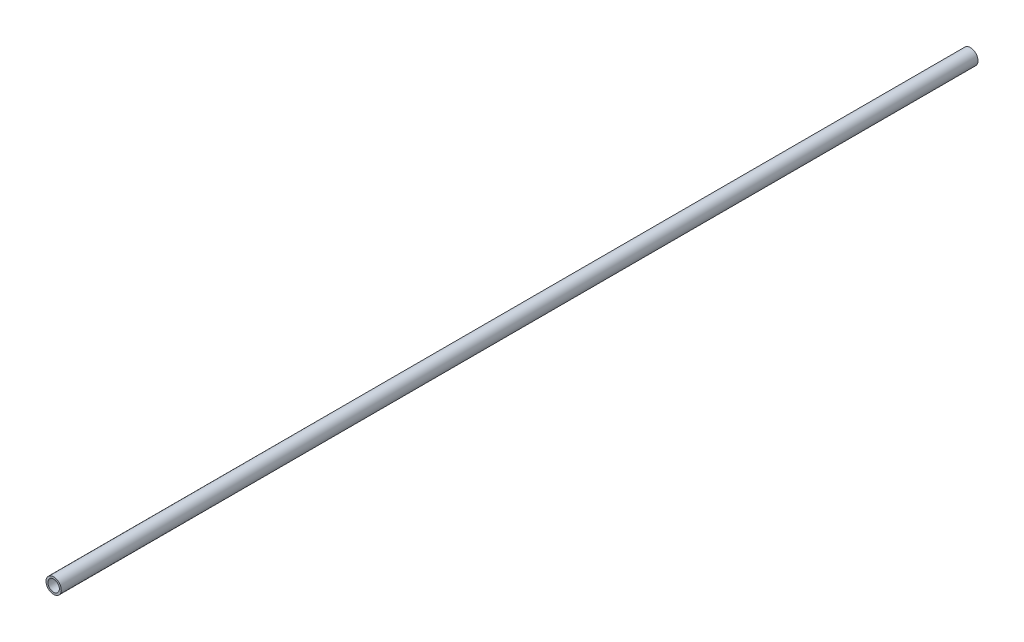
ISO-10303-21;
HEADER;
FILE_DESCRIPTION(('STEP AP214'),'2;1');
FILE_NAME('part.step','',(''),(''),'','','');
FILE_SCHEMA(('AUTOMOTIVE_DESIGN { 1 0 10303 214 1 1 1 1 }'));
ENDSEC;
DATA;
#1=APPLICATION_CONTEXT('core data for automotive mechanical design processes');
#2=APPLICATION_PROTOCOL_DEFINITION('international standard','automotive_design',2000,#1);
#3=PRODUCT_CONTEXT('',#1,'mechanical');
#4=PRODUCT('Part','Part','',(#3));
#5=PRODUCT_RELATED_PRODUCT_CATEGORY('part','',(#4));
#6=PRODUCT_DEFINITION_FORMATION('','',#4);
#7=PRODUCT_DEFINITION_CONTEXT('part definition',#1,'design');
#8=PRODUCT_DEFINITION('design','',#6,#7);
#9=PRODUCT_DEFINITION_SHAPE('','',#8);
#10=(LENGTH_UNIT() NAMED_UNIT(*) SI_UNIT(.MILLI.,.METRE.));
#11=(NAMED_UNIT(*) PLANE_ANGLE_UNIT() SI_UNIT($,.RADIAN.));
#12=(NAMED_UNIT(*) SI_UNIT($,.STERADIAN.) SOLID_ANGLE_UNIT());
#13=UNCERTAINTY_MEASURE_WITH_UNIT(LENGTH_MEASURE(1.E-05),#10,'distance_accuracy_value','');
#14=(GEOMETRIC_REPRESENTATION_CONTEXT(3) GLOBAL_UNCERTAINTY_ASSIGNED_CONTEXT((#13)) GLOBAL_UNIT_ASSIGNED_CONTEXT((#10,
#11,#12)) REPRESENTATION_CONTEXT('',''));
#15=CARTESIAN_POINT('',(0.,0.,0.));
#16=DIRECTION('',(0.,0.,1.));
#17=DIRECTION('',(1.,0.,0.));
#18=AXIS2_PLACEMENT_3D('',#15,#16,#17);
#19=CARTESIAN_POINT('',(0.,0.,1524.));
#20=DIRECTION('',(0.,0.,1.));
#21=DIRECTION('',(1.,0.,0.));
#22=AXIS2_PLACEMENT_3D('',#19,#20,#21);
#23=PLANE('',#22);
#24=CARTESIAN_POINT('',(0.,0.,1524.));
#25=DIRECTION('',(0.,0.,1.));
#26=DIRECTION('',(1.,0.,0.));
#27=AXIS2_PLACEMENT_3D('',#24,#25,#26);
#28=CIRCLE('',#27,12.7);
#29=CARTESIAN_POINT('',(12.7,0.,1524.));
#30=VERTEX_POINT('',#29);
#31=EDGE_CURVE('E10',#30,#30,#28,.T.);
#32=ORIENTED_EDGE('',*,*,#31,.T.);
#33=EDGE_LOOP('',(#32));
#34=FACE_BOUND('',#33,.T.);
#35=CARTESIAN_POINT('',(0.,0.,1524.));
#36=DIRECTION('',(0.,0.,1.));
#37=DIRECTION('',(1.,0.,0.));
#38=AXIS2_PLACEMENT_3D('',#35,#36,#37);
#39=CIRCLE('',#38,9.525);
#40=CARTESIAN_POINT('',(9.525,0.,1524.));
#41=VERTEX_POINT('',#40);
#42=EDGE_CURVE('E42',#41,#41,#39,.T.);
#43=ORIENTED_EDGE('',*,*,#42,.F.);
#44=EDGE_LOOP('',(#43));
#45=FACE_BOUND('',#44,.T.);
#46=ADVANCED_FACE('F31',(#34,#45),#23,.T.);
#47=CARTESIAN_POINT('',(0.,0.,0.));
#48=DIRECTION('',(0.,0.,1.));
#49=DIRECTION('',(1.,0.,0.));
#50=AXIS2_PLACEMENT_3D('',#47,#48,#49);
#51=PLANE('',#50);
#52=CARTESIAN_POINT('',(0.,0.,0.));
#53=DIRECTION('',(0.,0.,1.));
#54=DIRECTION('',(1.,0.,0.));
#55=AXIS2_PLACEMENT_3D('',#52,#53,#54);
#56=CIRCLE('',#55,12.7);
#57=CARTESIAN_POINT('',(12.7,0.,0.));
#58=VERTEX_POINT('',#57);
#59=EDGE_CURVE('E35',#58,#58,#56,.T.);
#60=ORIENTED_EDGE('',*,*,#59,.F.);
#61=EDGE_LOOP('',(#60));
#62=FACE_BOUND('',#61,.T.);
#63=CARTESIAN_POINT('',(0.,0.,0.));
#64=DIRECTION('',(0.,0.,1.));
#65=DIRECTION('',(1.,0.,0.));
#66=AXIS2_PLACEMENT_3D('',#63,#64,#65);
#67=CIRCLE('',#66,9.525);
#68=CARTESIAN_POINT('',(9.525,0.,0.));
#69=VERTEX_POINT('',#68);
#70=EDGE_CURVE('E44',#69,#69,#67,.T.);
#71=ORIENTED_EDGE('',*,*,#70,.T.);
#72=EDGE_LOOP('',(#71));
#73=FACE_BOUND('',#72,.T.);
#74=ADVANCED_FACE('F54',(#62,#73),#51,.F.);
#75=CARTESIAN_POINT('',(0.,0.,1524.));
#76=DIRECTION('',(0.,0.,-1.));
#77=DIRECTION('',(-1.,0.,0.));
#78=AXIS2_PLACEMENT_3D('',#75,#76,#77);
#79=CYLINDRICAL_SURFACE('',#78,12.7);
#80=ORIENTED_EDGE('',*,*,#31,.F.);
#81=EDGE_LOOP('',(#80));
#82=FACE_BOUND('',#81,.T.);
#83=ORIENTED_EDGE('',*,*,#59,.T.);
#84=EDGE_LOOP('',(#83));
#85=FACE_BOUND('',#84,.T.);
#86=ADVANCED_FACE('F33',(#82,#85),#79,.T.);
#87=CARTESIAN_POINT('',(0.,0.,1524.));
#88=DIRECTION('',(0.,0.,-1.));
#89=DIRECTION('',(-1.,0.,0.));
#90=AXIS2_PLACEMENT_3D('',#87,#88,#89);
#91=CYLINDRICAL_SURFACE('',#90,9.525);
#92=ORIENTED_EDGE('',*,*,#42,.T.);
#93=EDGE_LOOP('',(#92));
#94=FACE_BOUND('',#93,.T.);
#95=ORIENTED_EDGE('',*,*,#70,.F.);
#96=EDGE_LOOP('',(#95));
#97=FACE_BOUND('',#96,.T.);
#98=ADVANCED_FACE('F50',(#94,#97),#91,.F.);
#99=CLOSED_SHELL('',(#46,#74,#86,#98));
#100=MANIFOLD_SOLID_BREP('B2',#99);
#101=ADVANCED_BREP_SHAPE_REPRESENTATION('',(#18,#100),#14);
#102=SHAPE_DEFINITION_REPRESENTATION(#9,#101);
ENDSEC;
END-ISO-10303-21;
